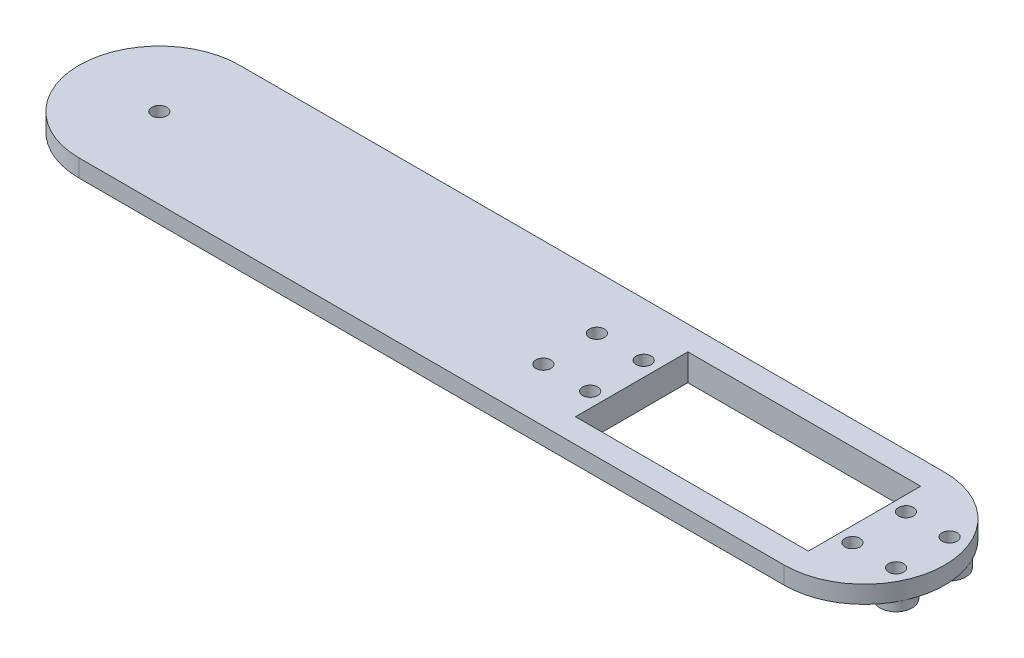
ISO-10303-21;
HEADER;
FILE_DESCRIPTION(('STEP AP214'),'2;1');
FILE_NAME('part.step','',(''),(''),'','','');
FILE_SCHEMA(('AUTOMOTIVE_DESIGN { 1 0 10303 214 1 1 1 1 }'));
ENDSEC;
DATA;
#1=APPLICATION_CONTEXT('core data for automotive mechanical design processes');
#2=APPLICATION_PROTOCOL_DEFINITION('international standard','automotive_design',2000,#1);
#3=PRODUCT_CONTEXT('',#1,'mechanical');
#4=PRODUCT('Part','Part','',(#3));
#5=PRODUCT_RELATED_PRODUCT_CATEGORY('part','',(#4));
#6=PRODUCT_DEFINITION_FORMATION('','',#4);
#7=PRODUCT_DEFINITION_CONTEXT('part definition',#1,'design');
#8=PRODUCT_DEFINITION('design','',#6,#7);
#9=PRODUCT_DEFINITION_SHAPE('','',#8);
#10=(LENGTH_UNIT() NAMED_UNIT(*) SI_UNIT(.MILLI.,.METRE.));
#11=(NAMED_UNIT(*) PLANE_ANGLE_UNIT() SI_UNIT($,.RADIAN.));
#12=(NAMED_UNIT(*) SI_UNIT($,.STERADIAN.) SOLID_ANGLE_UNIT());
#13=UNCERTAINTY_MEASURE_WITH_UNIT(LENGTH_MEASURE(1.E-05),#10,'distance_accuracy_value','');
#14=(GEOMETRIC_REPRESENTATION_CONTEXT(3) GLOBAL_UNCERTAINTY_ASSIGNED_CONTEXT((#13)) GLOBAL_UNIT_ASSIGNED_CONTEXT((#10,
#11,#12)) REPRESENTATION_CONTEXT('',''));
#15=CARTESIAN_POINT('',(0.,0.,0.));
#16=DIRECTION('',(0.,0.,1.));
#17=DIRECTION('',(1.,0.,0.));
#18=AXIS2_PLACEMENT_3D('',#15,#16,#17);
#19=CARTESIAN_POINT('',(131.75,1.73205080756887,0.));
#20=DIRECTION('',(0.,1.,0.));
#21=DIRECTION('',(0.,0.,1.));
#22=AXIS2_PLACEMENT_3D('',#19,#20,#21);
#23=CONICAL_SURFACE('',#22,15.,1.0471975511966);
#24=CARTESIAN_POINT('',(131.75,0.,0.));
#25=DIRECTION('',(0.,1.,0.));
#26=DIRECTION('',(0.,0.,1.));
#27=AXIS2_PLACEMENT_3D('',#24,#25,#26);
#28=CIRCLE('',#27,12.);
#29=CARTESIAN_POINT('',(141.077618933992,0.,7.54953806681159));
#30=VERTEX_POINT('',#29);
#31=CARTESIAN_POINT('',(131.75,0.,12.));
#32=VERTEX_POINT('',#31);
#33=EDGE_CURVE('E159',#30,#32,#28,.F.);
#34=ORIENTED_EDGE('',*,*,#33,.F.);
#35=CARTESIAN_POINT('',(141.077322224237,-0.000199999999996111,7.54935403868239));
#36=CARTESIAN_POINT('',(141.156557252533,0.0532118295520342,7.59849532245088));
#37=CARTESIAN_POINT('',(141.238157752973,0.106367857717863,7.64400414252747));
#38=CARTESIAN_POINT('',(141.405675913293,0.211924213773523,7.72739358204016));
#39=CARTESIAN_POINT('',(141.491595007884,0.264324282980244,7.76527164519906));
#40=CARTESIAN_POINT('',(141.755674700648,0.420294178495787,7.86707972239535));
#41=CARTESIAN_POINT('',(141.939658060023,0.522297255177833,7.91887223220731));
#42=CARTESIAN_POINT('',(142.318130790524,0.719604901713635,7.98681766693719));
#43=CARTESIAN_POINT('',(142.512644761588,0.814892474504301,8.00288309639194));
#44=CARTESIAN_POINT('',(142.905273479851,0.995738739577225,7.99627527436064));
#45=CARTESIAN_POINT('',(143.103381423363,1.08131396044428,7.97366892195532));
#46=CARTESIAN_POINT('',(143.479570242659,1.23346886037972,7.89137434460176));
#47=CARTESIAN_POINT('',(143.657943074556,1.30103767076017,7.83493708453998));
#48=CARTESIAN_POINT('',(143.917769278529,1.39282671410162,7.72464089293873));
#49=CARTESIAN_POINT('',(144.003120344002,1.42183829990772,7.68358149180939));
#50=CARTESIAN_POINT('',(144.170380115844,1.47642684541736,7.59304892589497));
#51=CARTESIAN_POINT('',(144.252289255344,1.50200423817333,7.54357682373972));
#52=CARTESIAN_POINT('',(144.473365142052,1.56780084372085,7.3949870309063));
#53=CARTESIAN_POINT('',(144.607925303175,1.60408236587907,7.28702479306733));
#54=CARTESIAN_POINT('',(144.857786247804,1.66365305840951,7.04791607168046));
#55=CARTESIAN_POINT('',(144.973101256229,1.68695185493206,6.91678686074885));
#56=CARTESIAN_POINT('',(145.17061181912,1.71824302781424,6.64792576225172));
#57=CARTESIAN_POINT('',(145.254843331859,1.72741466654152,6.51182432536296));
#58=CARTESIAN_POINT('',(145.400634043372,1.73395720153714,6.22773560641838));
#59=CARTESIAN_POINT('',(145.46219944674,1.7313313298441,6.0797515906164));
#60=CARTESIAN_POINT('',(145.558959984953,1.71470669394242,5.78235505494441));
#61=CARTESIAN_POINT('',(145.595078374449,1.70114927945453,5.63321644011278));
#62=CARTESIAN_POINT('',(145.64412187416,1.66364939914969,5.33247956634603));
#63=CARTESIAN_POINT('',(145.657047018265,1.63970694850689,5.18088131100513));
#64=CARTESIAN_POINT('',(145.660100556809,1.58165494976071,4.87679354111259));
#65=CARTESIAN_POINT('',(145.649840452357,1.54738060028454,4.72433217892592));
#66=CARTESIAN_POINT('',(145.606972106302,1.469768129052,4.42498204919217));
#67=CARTESIAN_POINT('',(145.574357809823,1.42642755381983,4.27809480283425));
#68=CARTESIAN_POINT('',(145.485912140682,1.32873844846912,3.98414475732927));
#69=CARTESIAN_POINT('',(145.428740320811,1.27386634548731,3.83766084394092));
#70=CARTESIAN_POINT('',(145.293933076532,1.15640642671068,3.55786580455135));
#71=CARTESIAN_POINT('',(145.216294424116,1.09381739463867,3.42455676104226));
#72=CARTESIAN_POINT('',(145.03531961341,0.9560317423036,3.16165162296549));
#73=CARTESIAN_POINT('',(144.930256154494,0.8802032181653,3.03357664651878));
#74=CARTESIAN_POINT('',(144.702831974037,0.722439146842617,2.79808492927113));
#75=CARTESIAN_POINT('',(144.580452359523,0.6404969760838,2.6906910590455));
#76=CARTESIAN_POINT('',(144.314666021577,0.467265574352683,2.49265184098017));
#77=CARTESIAN_POINT('',(144.170458773441,0.375709791660956,2.40330840728899));
#78=CARTESIAN_POINT('',(143.946044711935,0.236111891456239,2.28894315810378));
#79=CARTESIAN_POINT('',(143.869946077227,0.1892357821765,2.25411406625341));
#80=CARTESIAN_POINT('',(143.71544404268,0.0949069920211402,2.19103843568445));
#81=CARTESIAN_POINT('',(143.637041267394,0.0474544693952105,2.16279013139788));
#82=CARTESIAN_POINT('',(143.557677692172,-0.000200000000005171,2.13785729034971));
#83=B_SPLINE_CURVE_WITH_KNOTS('',3,(#35,#36,#37,#38,#39,#40,#41,#42,#43,#44,#45,#46,#47,#48,#49,
#50,#51,#52,#53,#54,#55,#56,#57,#58,#59,#60,#61,#62,#63,#64,#65,#66,#67,#68,#69,#70,#71,#72,#73,
#74,#75,#76,#77,#78,#79,#80,#81,#82),.UNSPECIFIED.,.F.,.F.,(4,2,2,2,2,2,2,2,2,2,2,2,2,2,2,2,2,2,
2,2,2,2,2,4),(0.,0.322173911690689,0.644455571713671,1.2910284071438,1.93918296091379,
2.58621739284116,3.17927178079541,3.47602612178944,3.7727430067872,4.29849498135218,
4.82385661224604,5.30238850109788,5.78078929964637,6.2407881517004,6.70078633162678,
7.1685494182307,7.636439253668,8.13398299914619,8.63160526375326,9.17590331670915,
9.72079987775982,10.2967240672052,10.584280375072,10.8717594450088),.UNSPECIFIED.);
#84=CARTESIAN_POINT('',(145.385890143295,1.73205080756883,6.25));
#85=VERTEX_POINT('',#84);
#86=EDGE_CURVE('E11',#30,#85,#83,.T.);
#87=ORIENTED_EDGE('',*,*,#86,.T.);
#88=CARTESIAN_POINT('',(131.75,1.73205080756887,0.));
#89=DIRECTION('',(0.,1.,0.));
#90=DIRECTION('',(0.,0.,1.));
#91=AXIS2_PLACEMENT_3D('',#88,#89,#90);
#92=CIRCLE('',#91,15.);
#93=CARTESIAN_POINT('',(131.75,1.73205080756887,15.));
#94=VERTEX_POINT('',#93);
#95=EDGE_CURVE('E173',#94,#85,#92,.T.);
#96=ORIENTED_EDGE('',*,*,#95,.F.);
#97=DIRECTION('',(0.,0.499999999999995,0.866025403784441));
#98=VECTOR('',#97,1.);
#99=CARTESIAN_POINT('',(131.75,0.,12.));
#100=LINE('',#99,#98);
#101=EDGE_CURVE('E183',#32,#94,#100,.T.);
#102=ORIENTED_EDGE('',*,*,#101,.F.);
#103=EDGE_LOOP('',(#34,#87,#96,#102));
#104=FACE_BOUND('',#103,.T.);
#105=ADVANCED_FACE('F43',(#104),#23,.T.);
#106=CARTESIAN_POINT('',(145.385890143295,1.73205080756883,-6.25));
#107=VERTEX_POINT('',#106);
#108=EDGE_CURVE('E153',#85,#107,#92,.T.);
#109=ORIENTED_EDGE('',*,*,#108,.F.);
#110=CARTESIAN_POINT('',(143.558010788115,0.,2.13796193318843));
#111=VERTEX_POINT('',#110);
#112=EDGE_CURVE('E48',#85,#111,#83,.T.);
#113=ORIENTED_EDGE('',*,*,#112,.T.);
#114=CARTESIAN_POINT('',(143.558010788115,0.,-2.13796193318843));
#115=VERTEX_POINT('',#114);
#116=EDGE_CURVE('E152',#115,#111,#28,.F.);
#117=ORIENTED_EDGE('',*,*,#116,.F.);
#118=CARTESIAN_POINT('',(141.077322224237,-0.000199999999996111,-7.54935403868239));
#119=CARTESIAN_POINT('',(141.156557252533,0.0532118295520342,-7.59849532245088));
#120=CARTESIAN_POINT('',(141.238157752973,0.106367857717863,-7.64400414252747));
#121=CARTESIAN_POINT('',(141.405675913293,0.211924213773523,-7.72739358204016));
#122=CARTESIAN_POINT('',(141.491595007884,0.264324282980244,-7.76527164519906));
#123=CARTESIAN_POINT('',(141.755674700648,0.420294178495787,-7.86707972239535));
#124=CARTESIAN_POINT('',(141.939658060023,0.522297255177833,-7.91887223220731));
#125=CARTESIAN_POINT('',(142.318130790524,0.719604901713635,-7.98681766693719));
#126=CARTESIAN_POINT('',(142.512644761588,0.814892474504301,-8.00288309639194));
#127=CARTESIAN_POINT('',(142.905273479851,0.995738739577225,-7.99627527436064));
#128=CARTESIAN_POINT('',(143.103381423363,1.08131396044428,-7.97366892195532));
#129=CARTESIAN_POINT('',(143.479570242659,1.23346886037972,-7.89137434460176));
#130=CARTESIAN_POINT('',(143.657943074556,1.30103767076017,-7.83493708453998));
#131=CARTESIAN_POINT('',(143.917769278529,1.39282671410162,-7.72464089293873));
#132=CARTESIAN_POINT('',(144.003120344002,1.42183829990772,-7.68358149180939));
#133=CARTESIAN_POINT('',(144.170380115844,1.47642684541736,-7.59304892589497));
#134=CARTESIAN_POINT('',(144.252289255344,1.50200423817333,-7.54357682373972));
#135=CARTESIAN_POINT('',(144.473365142052,1.56780084372085,-7.3949870309063));
#136=CARTESIAN_POINT('',(144.607925303175,1.60408236587907,-7.28702479306733));
#137=CARTESIAN_POINT('',(144.857786247804,1.66365305840951,-7.04791607168046));
#138=CARTESIAN_POINT('',(144.973101256229,1.68695185493206,-6.91678686074885));
#139=CARTESIAN_POINT('',(145.17061181912,1.71824302781424,-6.64792576225172));
#140=CARTESIAN_POINT('',(145.254843331859,1.72741466654152,-6.51182432536296));
#141=CARTESIAN_POINT('',(145.400634043372,1.73395720153714,-6.22773560641838));
#142=CARTESIAN_POINT('',(145.46219944674,1.7313313298441,-6.0797515906164));
#143=CARTESIAN_POINT('',(145.558959984953,1.71470669394242,-5.78235505494441));
#144=CARTESIAN_POINT('',(145.595078374449,1.70114927945453,-5.63321644011278));
#145=CARTESIAN_POINT('',(145.64412187416,1.66364939914969,-5.33247956634603));
#146=CARTESIAN_POINT('',(145.657047018265,1.63970694850689,-5.18088131100513));
#147=CARTESIAN_POINT('',(145.660100556809,1.58165494976071,-4.87679354111259));
#148=CARTESIAN_POINT('',(145.649840452357,1.54738060028454,-4.72433217892592));
#149=CARTESIAN_POINT('',(145.606972106302,1.469768129052,-4.42498204919217));
#150=CARTESIAN_POINT('',(145.574357809823,1.42642755381983,-4.27809480283425));
#151=CARTESIAN_POINT('',(145.485912140682,1.32873844846912,-3.98414475732927));
#152=CARTESIAN_POINT('',(145.428740320811,1.27386634548731,-3.83766084394092));
#153=CARTESIAN_POINT('',(145.293933076532,1.15640642671068,-3.55786580455135));
#154=CARTESIAN_POINT('',(145.216294424116,1.09381739463867,-3.42455676104226));
#155=CARTESIAN_POINT('',(145.03531961341,0.9560317423036,-3.16165162296549));
#156=CARTESIAN_POINT('',(144.930256154494,0.8802032181653,-3.03357664651878));
#157=CARTESIAN_POINT('',(144.702831974037,0.722439146842617,-2.79808492927113));
#158=CARTESIAN_POINT('',(144.580452359523,0.6404969760838,-2.6906910590455));
#159=CARTESIAN_POINT('',(144.314666021577,0.467265574352683,-2.49265184098017));
#160=CARTESIAN_POINT('',(144.170458773441,0.375709791660956,-2.40330840728899));
#161=CARTESIAN_POINT('',(143.946044711935,0.236111891456239,-2.28894315810378));
#162=CARTESIAN_POINT('',(143.869946077227,0.1892357821765,-2.25411406625341));
#163=CARTESIAN_POINT('',(143.71544404268,0.0949069920211402,-2.19103843568445));
#164=CARTESIAN_POINT('',(143.637041267394,0.0474544693952105,-2.16279013139788));
#165=CARTESIAN_POINT('',(143.557677692172,-0.000200000000005171,-2.13785729034971));
#166=B_SPLINE_CURVE_WITH_KNOTS('',3,(#118,#119,#120,#121,#122,#123,#124,#125,#126,#127,#128,
#129,#130,#131,#132,#133,#134,#135,#136,#137,#138,#139,#140,#141,#142,#143,#144,#145,#146,#147,
#148,#149,#150,#151,#152,#153,#154,#155,#156,#157,#158,#159,#160,#161,#162,#163,#164,#165),
.UNSPECIFIED.,.F.,.F.,(4,2,2,2,2,2,2,2,2,2,2,2,2,2,2,2,2,2,2,2,2,2,2,4),(0.,0.322173911690689,
0.644455571713671,1.2910284071438,1.93918296091379,2.58621739284116,3.17927178079541,
3.47602612178944,3.7727430067872,4.29849498135218,4.82385661224604,5.30238850109788,
5.78078929964637,6.2407881517004,6.70078633162678,7.1685494182307,7.636439253668,
8.13398299914619,8.63160526375326,9.17590331670915,9.72079987775982,10.2967240672052,
10.584280375072,10.8717594450088),.UNSPECIFIED.);
#167=EDGE_CURVE('E177',#107,#115,#166,.T.);
#168=ORIENTED_EDGE('',*,*,#167,.F.);
#169=EDGE_LOOP('',(#109,#113,#117,#168));
#170=FACE_BOUND('',#169,.T.);
#171=ADVANCED_FACE('F150',(#170),#23,.T.);
#172=CARTESIAN_POINT('',(141.077618933992,0.,-7.5495380668116));
#173=VERTEX_POINT('',#172);
#174=EDGE_CURVE('E155',#173,#107,#166,.T.);
#175=ORIENTED_EDGE('',*,*,#174,.F.);
#176=CARTESIAN_POINT('',(131.75,0.,-12.));
#177=VERTEX_POINT('',#176);
#178=EDGE_CURVE('E158',#177,#173,#28,.F.);
#179=ORIENTED_EDGE('',*,*,#178,.F.);
#180=DIRECTION('',(0.,-0.499999999999995,0.866025403784441));
#181=VECTOR('',#180,1.);
#182=CARTESIAN_POINT('',(131.75,1.73205080756887,-15.));
#183=LINE('',#182,#181);
#184=CARTESIAN_POINT('',(131.75,1.73205080756887,-15.));
#185=VERTEX_POINT('',#184);
#186=EDGE_CURVE('E186',#185,#177,#183,.T.);
#187=ORIENTED_EDGE('',*,*,#186,.F.);
#188=EDGE_CURVE('E172',#107,#185,#92,.T.);
#189=ORIENTED_EDGE('',*,*,#188,.F.);
#190=EDGE_LOOP('',(#175,#179,#187,#189));
#191=FACE_BOUND('',#190,.T.);
#192=ADVANCED_FACE('F251',(#191),#23,.T.);
#193=CARTESIAN_POINT('',(0.,5.,0.));
#194=DIRECTION('',(0.,1.,0.));
#195=DIRECTION('',(0.,0.,1.));
#196=AXIS2_PLACEMENT_3D('',#193,#194,#195);
#197=PLANE('',#196);
#198=CARTESIAN_POINT('',(142.658712114636,5.,5.));
#199=DIRECTION('',(0.,1.,0.));
#200=DIRECTION('',(0.,0.,1.));
#201=AXIS2_PLACEMENT_3D('',#198,#199,#200);
#202=CIRCLE('',#201,1.40000000000003);
#203=CARTESIAN_POINT('',(142.658712114636,5.,6.40000000000003));
#204=VERTEX_POINT('',#203);
#205=EDGE_CURVE('E145',#204,#204,#202,.T.);
#206=ORIENTED_EDGE('',*,*,#205,.F.);
#207=EDGE_LOOP('',(#206));
#208=FACE_BOUND('',#207,.T.);
#209=CARTESIAN_POINT('',(142.658712114636,5.,-5.));
#210=DIRECTION('',(0.,-1.,0.));
#211=DIRECTION('',(0.,0.,-1.));
#212=AXIS2_PLACEMENT_3D('',#209,#210,#211);
#213=CIRCLE('',#212,1.40000000000003);
#214=CARTESIAN_POINT('',(142.658712114636,5.,-6.40000000000003));
#215=VERTEX_POINT('',#214);
#216=EDGE_CURVE('E419',#215,#215,#213,.T.);
#217=ORIENTED_EDGE('',*,*,#216,.T.);
#218=EDGE_LOOP('',(#217));
#219=FACE_BOUND('',#218,.T.);
#220=CARTESIAN_POINT('',(76.7500000000001,5.,5.));
#221=DIRECTION('',(0.,-1.,0.));
#222=DIRECTION('',(0.,0.,-1.));
#223=AXIS2_PLACEMENT_3D('',#220,#221,#222);
#224=CIRCLE('',#223,1.4);
#225=CARTESIAN_POINT('',(76.7500000000001,5.,3.59999999999999));
#226=VERTEX_POINT('',#225);
#227=EDGE_CURVE('E181',#226,#226,#224,.T.);
#228=ORIENTED_EDGE('',*,*,#227,.T.);
#229=EDGE_LOOP('',(#228));
#230=FACE_BOUND('',#229,.T.);
#231=CARTESIAN_POINT('',(76.7500000000001,5.,-5.00000000000001));
#232=DIRECTION('',(0.,-1.,0.));
#233=DIRECTION('',(0.,0.,1.));
#234=AXIS2_PLACEMENT_3D('',#231,#232,#233);
#235=CIRCLE('',#234,1.4);
#236=CARTESIAN_POINT('',(76.7500000000001,5.,-3.6));
#237=VERTEX_POINT('',#236);
#238=EDGE_CURVE('E407',#237,#237,#235,.T.);
#239=ORIENTED_EDGE('',*,*,#238,.T.);
#240=EDGE_LOOP('',(#239));
#241=FACE_BOUND('',#240,.T.);
#242=CARTESIAN_POINT('',(134.5,5.,5.));
#243=DIRECTION('',(0.,1.,0.));
#244=DIRECTION('',(0.,0.,1.));
#245=AXIS2_PLACEMENT_3D('',#242,#243,#244);
#246=CIRCLE('',#245,1.40000000000003);
#247=CARTESIAN_POINT('',(134.5,5.,6.40000000000003));
#248=VERTEX_POINT('',#247);
#249=EDGE_CURVE('E394',#248,#248,#246,.T.);
#250=ORIENTED_EDGE('',*,*,#249,.F.);
#251=EDGE_LOOP('',(#250));
#252=FACE_BOUND('',#251,.T.);
#253=CARTESIAN_POINT('',(85.5000000000001,5.,-5.));
#254=DIRECTION('',(0.,1.,0.));
#255=DIRECTION('',(0.,0.,1.));
#256=AXIS2_PLACEMENT_3D('',#253,#254,#255);
#257=CIRCLE('',#256,1.4);
#258=CARTESIAN_POINT('',(85.5000000000001,5.,-3.6));
#259=VERTEX_POINT('',#258);
#260=EDGE_CURVE('E382',#259,#259,#257,.T.);
#261=ORIENTED_EDGE('',*,*,#260,.F.);
#262=EDGE_LOOP('',(#261));
#263=FACE_BOUND('',#262,.T.);
#264=DIRECTION('',(-1.,0.,0.));
#265=VECTOR('',#264,1.);
#266=CARTESIAN_POINT('',(88.2500000000001,5.,-10.5));
#267=LINE('',#266,#265);
#268=CARTESIAN_POINT('',(131.75,5.,-10.5));
#269=VERTEX_POINT('',#268);
#270=CARTESIAN_POINT('',(88.2500000000001,5.,-10.5));
#271=VERTEX_POINT('',#270);
#272=EDGE_CURVE('E376',#269,#271,#267,.T.);
#273=ORIENTED_EDGE('',*,*,#272,.F.);
#274=DIRECTION('',(0.,0.,-1.));
#275=VECTOR('',#274,1.);
#276=CARTESIAN_POINT('',(131.75,5.,10.5));
#277=LINE('',#276,#275);
#278=CARTESIAN_POINT('',(131.75,5.,10.5));
#279=VERTEX_POINT('',#278);
#280=EDGE_CURVE('E361',#279,#269,#277,.T.);
#281=ORIENTED_EDGE('',*,*,#280,.F.);
#282=DIRECTION('',(1.,0.,0.));
#283=VECTOR('',#282,1.);
#284=CARTESIAN_POINT('',(88.2500000000001,5.,10.5));
#285=LINE('',#284,#283);
#286=CARTESIAN_POINT('',(88.2500000000001,5.,10.5));
#287=VERTEX_POINT('',#286);
#288=EDGE_CURVE('E357',#287,#279,#285,.T.);
#289=ORIENTED_EDGE('',*,*,#288,.F.);
#290=DIRECTION('',(0.,0.,1.));
#291=VECTOR('',#290,1.);
#292=CARTESIAN_POINT('',(88.2500000000001,5.,10.5));
#293=LINE('',#292,#291);
#294=EDGE_CURVE('E373',#271,#287,#293,.T.);
#295=ORIENTED_EDGE('',*,*,#294,.F.);
#296=EDGE_LOOP('',(#273,#281,#289,#295));
#297=FACE_BOUND('',#296,.T.);
#298=CARTESIAN_POINT('',(131.75,5.,0.));
#299=DIRECTION('',(0.,1.,0.));
#300=DIRECTION('',(0.,0.,1.));
#301=AXIS2_PLACEMENT_3D('',#298,#299,#300);
#302=CIRCLE('',#301,15.);
#303=CARTESIAN_POINT('',(131.75,5.,15.));
#304=VERTEX_POINT('',#303);
#305=CARTESIAN_POINT('',(131.75,5.,-15.));
#306=VERTEX_POINT('',#305);
#307=EDGE_CURVE('E328',#304,#306,#302,.T.);
#308=ORIENTED_EDGE('',*,*,#307,.T.);
#309=DIRECTION('',(-1.,0.,0.));
#310=VECTOR('',#309,1.);
#311=CARTESIAN_POINT('',(0.,5.,-15.));
#312=LINE('',#311,#310);
#313=CARTESIAN_POINT('',(0.,5.,-15.));
#314=VERTEX_POINT('',#313);
#315=EDGE_CURVE('E324',#306,#314,#312,.T.);
#316=ORIENTED_EDGE('',*,*,#315,.T.);
#317=CARTESIAN_POINT('',(0.,5.,0.));
#318=DIRECTION('',(0.,1.,0.));
#319=DIRECTION('',(0.,0.,1.));
#320=AXIS2_PLACEMENT_3D('',#317,#318,#319);
#321=CIRCLE('',#320,15.);
#322=CARTESIAN_POINT('',(0.,5.,15.));
#323=VERTEX_POINT('',#322);
#324=EDGE_CURVE('E323',#314,#323,#321,.T.);
#325=ORIENTED_EDGE('',*,*,#324,.T.);
#326=DIRECTION('',(1.,0.,0.));
#327=VECTOR('',#326,1.);
#328=CARTESIAN_POINT('',(0.,5.,15.));
#329=LINE('',#328,#327);
#330=EDGE_CURVE('E343',#323,#304,#329,.T.);
#331=ORIENTED_EDGE('',*,*,#330,.T.);
#332=EDGE_LOOP('',(#308,#316,#325,#331));
#333=FACE_BOUND('',#332,.T.);
#334=CARTESIAN_POINT('',(0.,5.,0.));
#335=DIRECTION('',(0.,1.,0.));
#336=DIRECTION('',(0.,0.,1.));
#337=AXIS2_PLACEMENT_3D('',#334,#335,#336);
#338=CIRCLE('',#337,1.4);
#339=CARTESIAN_POINT('',(0.,5.,1.4));
#340=VERTEX_POINT('',#339);
#341=EDGE_CURVE('E371',#340,#340,#338,.T.);
#342=ORIENTED_EDGE('',*,*,#341,.F.);
#343=EDGE_LOOP('',(#342));
#344=FACE_BOUND('',#343,.T.);
#345=CARTESIAN_POINT('',(85.5000000000001,5.,5.));
#346=DIRECTION('',(0.,1.,0.));
#347=DIRECTION('',(0.,0.,-1.));
#348=AXIS2_PLACEMENT_3D('',#345,#346,#347);
#349=CIRCLE('',#348,1.4);
#350=CARTESIAN_POINT('',(85.5000000000001,5.,3.6));
#351=VERTEX_POINT('',#350);
#352=EDGE_CURVE('E388',#351,#351,#349,.T.);
#353=ORIENTED_EDGE('',*,*,#352,.F.);
#354=EDGE_LOOP('',(#353));
#355=FACE_BOUND('',#354,.T.);
#356=CARTESIAN_POINT('',(134.5,5.,-5.));
#357=DIRECTION('',(0.,1.,0.));
#358=DIRECTION('',(0.,0.,-1.));
#359=AXIS2_PLACEMENT_3D('',#356,#357,#358);
#360=CIRCLE('',#359,1.40000000000003);
#361=CARTESIAN_POINT('',(134.5,5.,-6.40000000000003));
#362=VERTEX_POINT('',#361);
#363=EDGE_CURVE('E400',#362,#362,#360,.T.);
#364=ORIENTED_EDGE('',*,*,#363,.F.);
#365=EDGE_LOOP('',(#364));
#366=FACE_BOUND('',#365,.T.);
#367=ADVANCED_FACE('F248',(#208,#219,#230,#241,#252,#263,#297,#333,#344,#355,#366),#197,.T.);
#368=CARTESIAN_POINT('',(0.,0.,0.));
#369=DIRECTION('',(0.,1.,0.));
#370=DIRECTION('',(0.,0.,1.));
#371=AXIS2_PLACEMENT_3D('',#368,#369,#370);
#372=PLANE('',#371);
#373=CARTESIAN_POINT('',(142.658712114636,0.,5.));
#374=DIRECTION('',(0.,1.,0.));
#375=DIRECTION('',(0.,0.,1.));
#376=AXIS2_PLACEMENT_3D('',#373,#374,#375);
#377=CIRCLE('',#376,1.40000000000003);
#378=CARTESIAN_POINT('',(142.658712114636,0.,6.40000000000003));
#379=VERTEX_POINT('',#378);
#380=EDGE_CURVE('E424',#379,#379,#377,.T.);
#381=ORIENTED_EDGE('',*,*,#380,.T.);
#382=EDGE_LOOP('',(#381));
#383=FACE_BOUND('',#382,.T.);
#384=ORIENTED_EDGE('',*,*,#116,.T.);
#385=CARTESIAN_POINT('',(142.658712114636,0.,5.));
#386=DIRECTION('',(0.,1.,0.));
#387=DIRECTION('',(0.,0.,1.));
#388=AXIS2_PLACEMENT_3D('',#385,#386,#387);
#389=CIRCLE('',#388,2.99999999999999);
#390=EDGE_CURVE('E64',#30,#111,#389,.T.);
#391=ORIENTED_EDGE('',*,*,#390,.F.);
#392=ORIENTED_EDGE('',*,*,#33,.T.);
#393=DIRECTION('',(-1.,0.,0.));
#394=VECTOR('',#393,1.);
#395=CARTESIAN_POINT('',(0.,0.,12.));
#396=LINE('',#395,#394);
#397=CARTESIAN_POINT('',(0.,0.,12.));
#398=VERTEX_POINT('',#397);
#399=EDGE_CURVE('E162',#32,#398,#396,.T.);
#400=ORIENTED_EDGE('',*,*,#399,.T.);
#401=CARTESIAN_POINT('',(0.,0.,0.));
#402=DIRECTION('',(0.,1.,0.));
#403=DIRECTION('',(0.,0.,1.));
#404=AXIS2_PLACEMENT_3D('',#401,#402,#403);
#405=CIRCLE('',#404,12.);
#406=CARTESIAN_POINT('',(0.,0.,-12.));
#407=VERTEX_POINT('',#406);
#408=EDGE_CURVE('E167',#398,#407,#405,.F.);
#409=ORIENTED_EDGE('',*,*,#408,.T.);
#410=DIRECTION('',(1.,0.,0.));
#411=VECTOR('',#410,1.);
#412=CARTESIAN_POINT('',(0.,0.,-12.));
#413=LINE('',#412,#411);
#414=EDGE_CURVE('E161',#407,#177,#413,.T.);
#415=ORIENTED_EDGE('',*,*,#414,.T.);
#416=ORIENTED_EDGE('',*,*,#178,.T.);
#417=CARTESIAN_POINT('',(142.658712114636,0.,-5.));
#418=DIRECTION('',(0.,-1.,0.));
#419=DIRECTION('',(0.,0.,-1.));
#420=AXIS2_PLACEMENT_3D('',#417,#418,#419);
#421=CIRCLE('',#420,2.99999999999999);
#422=EDGE_CURVE('E70',#173,#115,#421,.T.);
#423=ORIENTED_EDGE('',*,*,#422,.T.);
#424=EDGE_LOOP('',(#384,#391,#392,#400,#409,#415,#416,#423));
#425=FACE_BOUND('',#424,.T.);
#426=CARTESIAN_POINT('',(142.658712114636,0.,-5.));
#427=DIRECTION('',(0.,-1.,0.));
#428=DIRECTION('',(0.,0.,-1.));
#429=AXIS2_PLACEMENT_3D('',#426,#427,#428);
#430=CIRCLE('',#429,1.40000000000003);
#431=CARTESIAN_POINT('',(142.658712114636,0.,-6.40000000000003));
#432=VERTEX_POINT('',#431);
#433=EDGE_CURVE('E144',#432,#432,#430,.T.);
#434=ORIENTED_EDGE('',*,*,#433,.F.);
#435=EDGE_LOOP('',(#434));
#436=FACE_BOUND('',#435,.T.);
#437=CARTESIAN_POINT('',(76.7500000000001,0.,5.));
#438=DIRECTION('',(0.,-1.,0.));
#439=DIRECTION('',(0.,0.,-1.));
#440=AXIS2_PLACEMENT_3D('',#437,#438,#439);
#441=CIRCLE('',#440,1.4);
#442=CARTESIAN_POINT('',(76.7500000000001,0.,3.59999999999999));
#443=VERTEX_POINT('',#442);
#444=EDGE_CURVE('E413',#443,#443,#441,.T.);
#445=ORIENTED_EDGE('',*,*,#444,.F.);
#446=EDGE_LOOP('',(#445));
#447=FACE_BOUND('',#446,.T.);
#448=CARTESIAN_POINT('',(76.7500000000001,0.,-5.00000000000001));
#449=DIRECTION('',(0.,-1.,0.));
#450=DIRECTION('',(0.,0.,1.));
#451=AXIS2_PLACEMENT_3D('',#448,#449,#450);
#452=CIRCLE('',#451,1.4);
#453=CARTESIAN_POINT('',(76.7500000000001,0.,-3.6));
#454=VERTEX_POINT('',#453);
#455=EDGE_CURVE('E410',#454,#454,#452,.T.);
#456=ORIENTED_EDGE('',*,*,#455,.F.);
#457=EDGE_LOOP('',(#456));
#458=FACE_BOUND('',#457,.T.);
#459=DIRECTION('',(0.,0.,-1.));
#460=VECTOR('',#459,1.);
#461=CARTESIAN_POINT('',(131.75,0.,10.5));
#462=LINE('',#461,#460);
#463=CARTESIAN_POINT('',(131.75,0.,10.5));
#464=VERTEX_POINT('',#463);
#465=CARTESIAN_POINT('',(131.75,0.,-10.5));
#466=VERTEX_POINT('',#465);
#467=EDGE_CURVE('E368',#464,#466,#462,.T.);
#468=ORIENTED_EDGE('',*,*,#467,.T.);
#469=DIRECTION('',(-1.,0.,0.));
#470=VECTOR('',#469,1.);
#471=CARTESIAN_POINT('',(88.2500000000001,0.,-10.5));
#472=LINE('',#471,#470);
#473=CARTESIAN_POINT('',(88.2500000000001,0.,-10.5));
#474=VERTEX_POINT('',#473);
#475=EDGE_CURVE('E365',#466,#474,#472,.T.);
#476=ORIENTED_EDGE('',*,*,#475,.T.);
#477=DIRECTION('',(0.,0.,1.));
#478=VECTOR('',#477,1.);
#479=CARTESIAN_POINT('',(88.2500000000001,0.,10.5));
#480=LINE('',#479,#478);
#481=CARTESIAN_POINT('',(88.2500000000001,0.,10.5));
#482=VERTEX_POINT('',#481);
#483=EDGE_CURVE('E362',#474,#482,#480,.T.);
#484=ORIENTED_EDGE('',*,*,#483,.T.);
#485=DIRECTION('',(1.,0.,0.));
#486=VECTOR('',#485,1.);
#487=CARTESIAN_POINT('',(88.2500000000001,0.,10.5));
#488=LINE('',#487,#486);
#489=EDGE_CURVE('E358',#482,#464,#488,.T.);
#490=ORIENTED_EDGE('',*,*,#489,.T.);
#491=EDGE_LOOP('',(#468,#476,#484,#490));
#492=FACE_BOUND('',#491,.T.);
#493=CARTESIAN_POINT('',(0.,0.,0.));
#494=DIRECTION('',(0.,1.,0.));
#495=DIRECTION('',(0.,0.,1.));
#496=AXIS2_PLACEMENT_3D('',#493,#494,#495);
#497=CIRCLE('',#496,1.4);
#498=CARTESIAN_POINT('',(0.,0.,1.4));
#499=VERTEX_POINT('',#498);
#500=EDGE_CURVE('E379',#499,#499,#497,.T.);
#501=ORIENTED_EDGE('',*,*,#500,.T.);
#502=EDGE_LOOP('',(#501));
#503=FACE_BOUND('',#502,.T.);
#504=CARTESIAN_POINT('',(85.5000000000001,0.,-5.));
#505=DIRECTION('',(0.,1.,0.));
#506=DIRECTION('',(0.,0.,1.));
#507=AXIS2_PLACEMENT_3D('',#504,#505,#506);
#508=CIRCLE('',#507,1.4);
#509=CARTESIAN_POINT('',(85.5000000000001,0.,-3.6));
#510=VERTEX_POINT('',#509);
#511=EDGE_CURVE('E385',#510,#510,#508,.T.);
#512=ORIENTED_EDGE('',*,*,#511,.T.);
#513=EDGE_LOOP('',(#512));
#514=FACE_BOUND('',#513,.T.);
#515=CARTESIAN_POINT('',(85.5000000000001,0.,5.));
#516=DIRECTION('',(0.,1.,0.));
#517=DIRECTION('',(0.,0.,-1.));
#518=AXIS2_PLACEMENT_3D('',#515,#516,#517);
#519=CIRCLE('',#518,1.4);
#520=CARTESIAN_POINT('',(85.5000000000001,0.,3.6));
#521=VERTEX_POINT('',#520);
#522=EDGE_CURVE('E391',#521,#521,#519,.T.);
#523=ORIENTED_EDGE('',*,*,#522,.T.);
#524=EDGE_LOOP('',(#523));
#525=FACE_BOUND('',#524,.T.);
#526=CARTESIAN_POINT('',(134.5,0.,5.));
#527=DIRECTION('',(0.,1.,0.));
#528=DIRECTION('',(0.,0.,1.));
#529=AXIS2_PLACEMENT_3D('',#526,#527,#528);
#530=CIRCLE('',#529,1.40000000000003);
#531=CARTESIAN_POINT('',(134.5,0.,6.40000000000003));
#532=VERTEX_POINT('',#531);
#533=EDGE_CURVE('E397',#532,#532,#530,.T.);
#534=ORIENTED_EDGE('',*,*,#533,.T.);
#535=EDGE_LOOP('',(#534));
#536=FACE_BOUND('',#535,.T.);
#537=CARTESIAN_POINT('',(134.5,0.,-5.));
#538=DIRECTION('',(0.,1.,0.));
#539=DIRECTION('',(0.,0.,-1.));
#540=AXIS2_PLACEMENT_3D('',#537,#538,#539);
#541=CIRCLE('',#540,1.40000000000003);
#542=CARTESIAN_POINT('',(134.5,0.,-6.40000000000003));
#543=VERTEX_POINT('',#542);
#544=EDGE_CURVE('E188',#543,#543,#541,.T.);
#545=ORIENTED_EDGE('',*,*,#544,.T.);
#546=EDGE_LOOP('',(#545));
#547=FACE_BOUND('',#546,.T.);
#548=ADVANCED_FACE('F156',(#383,#425,#436,#447,#458,#492,#503,#514,#525,#536,#547),#372,.F.);
#549=CARTESIAN_POINT('',(0.,5.,0.));
#550=DIRECTION('',(0.,-1.,0.));
#551=DIRECTION('',(0.,0.,-1.));
#552=AXIS2_PLACEMENT_3D('',#549,#550,#551);
#553=CYLINDRICAL_SURFACE('',#552,15.);
#554=DIRECTION('',(0.,-1.,0.));
#555=VECTOR('',#554,1.);
#556=CARTESIAN_POINT('',(0.,5.,-15.));
#557=LINE('',#556,#555);
#558=CARTESIAN_POINT('',(0.,1.73205080756887,-15.));
#559=VERTEX_POINT('',#558);
#560=EDGE_CURVE('E314',#314,#559,#557,.T.);
#561=ORIENTED_EDGE('',*,*,#560,.T.);
#562=CARTESIAN_POINT('',(0.,1.73205080756887,0.));
#563=DIRECTION('',(0.,1.,0.));
#564=DIRECTION('',(0.,0.,1.));
#565=AXIS2_PLACEMENT_3D('',#562,#563,#564);
#566=CIRCLE('',#565,15.);
#567=CARTESIAN_POINT('',(0.,1.73205080756887,15.));
#568=VERTEX_POINT('',#567);
#569=EDGE_CURVE('E320',#559,#568,#566,.T.);
#570=ORIENTED_EDGE('',*,*,#569,.T.);
#571=DIRECTION('',(0.,-1.,0.));
#572=VECTOR('',#571,1.);
#573=CARTESIAN_POINT('',(0.,5.,15.));
#574=LINE('',#573,#572);
#575=EDGE_CURVE('E334',#323,#568,#574,.T.);
#576=ORIENTED_EDGE('',*,*,#575,.F.);
#577=ORIENTED_EDGE('',*,*,#324,.F.);
#578=EDGE_LOOP('',(#561,#570,#576,#577));
#579=FACE_BOUND('',#578,.T.);
#580=ADVANCED_FACE('F255',(#579),#553,.T.);
#581=CARTESIAN_POINT('',(0.,5.,15.));
#582=DIRECTION('',(0.,0.,-1.));
#583=DIRECTION('',(-1.,0.,0.));
#584=AXIS2_PLACEMENT_3D('',#581,#582,#583);
#585=PLANE('',#584);
#586=ORIENTED_EDGE('',*,*,#575,.T.);
#587=DIRECTION('',(1.,0.,0.));
#588=VECTOR('',#587,1.);
#589=CARTESIAN_POINT('',(0.,1.73205080756887,15.));
#590=LINE('',#589,#588);
#591=EDGE_CURVE('E175',#568,#94,#590,.T.);
#592=ORIENTED_EDGE('',*,*,#591,.T.);
#593=DIRECTION('',(0.,-1.,0.));
#594=VECTOR('',#593,1.);
#595=CARTESIAN_POINT('',(131.75,5.,15.));
#596=LINE('',#595,#594);
#597=EDGE_CURVE('E326',#304,#94,#596,.T.);
#598=ORIENTED_EDGE('',*,*,#597,.F.);
#599=ORIENTED_EDGE('',*,*,#330,.F.);
#600=EDGE_LOOP('',(#586,#592,#598,#599));
#601=FACE_BOUND('',#600,.T.);
#602=ADVANCED_FACE('F263',(#601),#585,.F.);
#603=CARTESIAN_POINT('',(131.75,5.,0.));
#604=DIRECTION('',(0.,-1.,0.));
#605=DIRECTION('',(0.,0.,-1.));
#606=AXIS2_PLACEMENT_3D('',#603,#604,#605);
#607=CYLINDRICAL_SURFACE('',#606,15.);
#608=DIRECTION('',(0.,-1.,0.));
#609=VECTOR('',#608,1.);
#610=CARTESIAN_POINT('',(131.75,5.,-15.));
#611=LINE('',#610,#609);
#612=EDGE_CURVE('E317',#306,#185,#611,.T.);
#613=ORIENTED_EDGE('',*,*,#612,.F.);
#614=ORIENTED_EDGE('',*,*,#307,.F.);
#615=ORIENTED_EDGE('',*,*,#597,.T.);
#616=ORIENTED_EDGE('',*,*,#95,.T.);
#617=ORIENTED_EDGE('',*,*,#108,.T.);
#618=ORIENTED_EDGE('',*,*,#188,.T.);
#619=EDGE_LOOP('',(#613,#614,#615,#616,#617,#618));
#620=FACE_BOUND('',#619,.T.);
#621=ADVANCED_FACE('F259',(#620),#607,.T.);
#622=CARTESIAN_POINT('',(0.,5.,-15.));
#623=DIRECTION('',(0.,0.,1.));
#624=DIRECTION('',(1.,0.,0.));
#625=AXIS2_PLACEMENT_3D('',#622,#623,#624);
#626=PLANE('',#625);
#627=ORIENTED_EDGE('',*,*,#612,.T.);
#628=DIRECTION('',(-1.,0.,0.));
#629=VECTOR('',#628,1.);
#630=CARTESIAN_POINT('',(0.,1.73205080756887,-15.));
#631=LINE('',#630,#629);
#632=EDGE_CURVE('E170',#185,#559,#631,.T.);
#633=ORIENTED_EDGE('',*,*,#632,.T.);
#634=ORIENTED_EDGE('',*,*,#560,.F.);
#635=ORIENTED_EDGE('',*,*,#315,.F.);
#636=EDGE_LOOP('',(#627,#633,#634,#635));
#637=FACE_BOUND('',#636,.T.);
#638=ADVANCED_FACE('F246',(#637),#626,.F.);
#639=CARTESIAN_POINT('',(131.75,5.,10.5));
#640=DIRECTION('',(-1.,0.,0.));
#641=DIRECTION('',(0.,0.,1.));
#642=AXIS2_PLACEMENT_3D('',#639,#640,#641);
#643=PLANE('',#642);
#644=ORIENTED_EDGE('',*,*,#467,.F.);
#645=DIRECTION('',(0.,-1.,0.));
#646=VECTOR('',#645,1.);
#647=CARTESIAN_POINT('',(131.75,5.,10.5));
#648=LINE('',#647,#646);
#649=EDGE_CURVE('E354',#279,#464,#648,.T.);
#650=ORIENTED_EDGE('',*,*,#649,.F.);
#651=ORIENTED_EDGE('',*,*,#280,.T.);
#652=DIRECTION('',(0.,-1.,0.));
#653=VECTOR('',#652,1.);
#654=CARTESIAN_POINT('',(131.75,5.,-10.5));
#655=LINE('',#654,#653);
#656=EDGE_CURVE('E347',#269,#466,#655,.T.);
#657=ORIENTED_EDGE('',*,*,#656,.T.);
#658=EDGE_LOOP('',(#644,#650,#651,#657));
#659=FACE_BOUND('',#658,.T.);
#660=ADVANCED_FACE('F242',(#659),#643,.T.);
#661=CARTESIAN_POINT('',(88.2500000000001,5.,-10.5));
#662=DIRECTION('',(0.,0.,1.));
#663=DIRECTION('',(1.,0.,0.));
#664=AXIS2_PLACEMENT_3D('',#661,#662,#663);
#665=PLANE('',#664);
#666=ORIENTED_EDGE('',*,*,#475,.F.);
#667=ORIENTED_EDGE('',*,*,#656,.F.);
#668=ORIENTED_EDGE('',*,*,#272,.T.);
#669=DIRECTION('',(0.,-1.,0.));
#670=VECTOR('',#669,1.);
#671=CARTESIAN_POINT('',(88.2500000000001,5.,-10.5));
#672=LINE('',#671,#670);
#673=EDGE_CURVE('E350',#271,#474,#672,.T.);
#674=ORIENTED_EDGE('',*,*,#673,.T.);
#675=EDGE_LOOP('',(#666,#667,#668,#674));
#676=FACE_BOUND('',#675,.T.);
#677=ADVANCED_FACE('F238',(#676),#665,.T.);
#678=CARTESIAN_POINT('',(88.2500000000001,5.,10.5));
#679=DIRECTION('',(1.,0.,0.));
#680=DIRECTION('',(0.,0.,-1.));
#681=AXIS2_PLACEMENT_3D('',#678,#679,#680);
#682=PLANE('',#681);
#683=ORIENTED_EDGE('',*,*,#483,.F.);
#684=ORIENTED_EDGE('',*,*,#673,.F.);
#685=ORIENTED_EDGE('',*,*,#294,.T.);
#686=DIRECTION('',(0.,-1.,0.));
#687=VECTOR('',#686,1.);
#688=CARTESIAN_POINT('',(88.2500000000001,5.,10.5));
#689=LINE('',#688,#687);
#690=EDGE_CURVE('E352',#287,#482,#689,.T.);
#691=ORIENTED_EDGE('',*,*,#690,.T.);
#692=EDGE_LOOP('',(#683,#684,#685,#691));
#693=FACE_BOUND('',#692,.T.);
#694=ADVANCED_FACE('F234',(#693),#682,.T.);
#695=CARTESIAN_POINT('',(88.2500000000001,5.,10.5));
#696=DIRECTION('',(0.,0.,-1.));
#697=DIRECTION('',(-1.,0.,0.));
#698=AXIS2_PLACEMENT_3D('',#695,#696,#697);
#699=PLANE('',#698);
#700=ORIENTED_EDGE('',*,*,#489,.F.);
#701=ORIENTED_EDGE('',*,*,#690,.F.);
#702=ORIENTED_EDGE('',*,*,#288,.T.);
#703=ORIENTED_EDGE('',*,*,#649,.T.);
#704=EDGE_LOOP('',(#700,#701,#702,#703));
#705=FACE_BOUND('',#704,.T.);
#706=ADVANCED_FACE('F230',(#705),#699,.T.);
#707=CARTESIAN_POINT('',(0.,5.,0.));
#708=DIRECTION('',(0.,-1.,0.));
#709=DIRECTION('',(0.,0.,-1.));
#710=AXIS2_PLACEMENT_3D('',#707,#708,#709);
#711=CYLINDRICAL_SURFACE('',#710,1.4);
#712=ORIENTED_EDGE('',*,*,#341,.T.);
#713=EDGE_LOOP('',(#712));
#714=FACE_BOUND('',#713,.T.);
#715=ORIENTED_EDGE('',*,*,#500,.F.);
#716=EDGE_LOOP('',(#715));
#717=FACE_BOUND('',#716,.T.);
#718=ADVANCED_FACE('F226',(#714,#717),#711,.F.);
#719=CARTESIAN_POINT('',(85.5000000000001,5.,-5.));
#720=DIRECTION('',(0.,-1.,0.));
#721=DIRECTION('',(0.,0.,-1.));
#722=AXIS2_PLACEMENT_3D('',#719,#720,#721);
#723=CYLINDRICAL_SURFACE('',#722,1.4);
#724=ORIENTED_EDGE('',*,*,#260,.T.);
#725=EDGE_LOOP('',(#724));
#726=FACE_BOUND('',#725,.T.);
#727=ORIENTED_EDGE('',*,*,#511,.F.);
#728=EDGE_LOOP('',(#727));
#729=FACE_BOUND('',#728,.T.);
#730=ADVANCED_FACE('F222',(#726,#729),#723,.F.);
#731=CARTESIAN_POINT('',(85.5000000000001,5.,5.));
#732=DIRECTION('',(0.,-1.,0.));
#733=DIRECTION('',(0.,0.,-1.));
#734=AXIS2_PLACEMENT_3D('',#731,#732,#733);
#735=CYLINDRICAL_SURFACE('',#734,1.4);
#736=ORIENTED_EDGE('',*,*,#352,.T.);
#737=EDGE_LOOP('',(#736));
#738=FACE_BOUND('',#737,.T.);
#739=ORIENTED_EDGE('',*,*,#522,.F.);
#740=EDGE_LOOP('',(#739));
#741=FACE_BOUND('',#740,.T.);
#742=ADVANCED_FACE('F218',(#738,#741),#735,.F.);
#743=CARTESIAN_POINT('',(134.5,5.,5.));
#744=DIRECTION('',(0.,-1.,0.));
#745=DIRECTION('',(0.,0.,-1.));
#746=AXIS2_PLACEMENT_3D('',#743,#744,#745);
#747=CYLINDRICAL_SURFACE('',#746,1.40000000000003);
#748=ORIENTED_EDGE('',*,*,#249,.T.);
#749=EDGE_LOOP('',(#748));
#750=FACE_BOUND('',#749,.T.);
#751=ORIENTED_EDGE('',*,*,#533,.F.);
#752=EDGE_LOOP('',(#751));
#753=FACE_BOUND('',#752,.T.);
#754=ADVANCED_FACE('F214',(#750,#753),#747,.F.);
#755=CARTESIAN_POINT('',(134.5,5.,-5.));
#756=DIRECTION('',(0.,-1.,0.));
#757=DIRECTION('',(0.,0.,-1.));
#758=AXIS2_PLACEMENT_3D('',#755,#756,#757);
#759=CYLINDRICAL_SURFACE('',#758,1.40000000000003);
#760=ORIENTED_EDGE('',*,*,#363,.T.);
#761=EDGE_LOOP('',(#760));
#762=FACE_BOUND('',#761,.T.);
#763=ORIENTED_EDGE('',*,*,#544,.F.);
#764=EDGE_LOOP('',(#763));
#765=FACE_BOUND('',#764,.T.);
#766=ADVANCED_FACE('F210',(#762,#765),#759,.F.);
#767=CARTESIAN_POINT('',(0.,1.73205080756887,-15.));
#768=DIRECTION('',(0.,0.866025403784441,0.499999999999995));
#769=DIRECTION('',(-1.,0.,0.));
#770=AXIS2_PLACEMENT_3D('',#767,#768,#769);
#771=PLANE('',#770);
#772=ORIENTED_EDGE('',*,*,#186,.T.);
#773=ORIENTED_EDGE('',*,*,#414,.F.);
#774=DIRECTION('',(0.,-0.499999999999995,0.866025403784441));
#775=VECTOR('',#774,1.);
#776=CARTESIAN_POINT('',(0.,1.73205080756887,-15.));
#777=LINE('',#776,#775);
#778=EDGE_CURVE('E180',#559,#407,#777,.T.);
#779=ORIENTED_EDGE('',*,*,#778,.F.);
#780=ORIENTED_EDGE('',*,*,#632,.F.);
#781=EDGE_LOOP('',(#772,#773,#779,#780));
#782=FACE_BOUND('',#781,.T.);
#783=ADVANCED_FACE('F213',(#782),#771,.F.);
#784=CARTESIAN_POINT('',(0.,1.73205080756887,15.));
#785=DIRECTION('',(0.,0.866025403784441,-0.499999999999995));
#786=DIRECTION('',(1.,0.,0.));
#787=AXIS2_PLACEMENT_3D('',#784,#785,#786);
#788=PLANE('',#787);
#789=ORIENTED_EDGE('',*,*,#101,.T.);
#790=ORIENTED_EDGE('',*,*,#591,.F.);
#791=DIRECTION('',(0.,0.499999999999995,0.866025403784441));
#792=VECTOR('',#791,1.);
#793=CARTESIAN_POINT('',(0.,0.,12.));
#794=LINE('',#793,#792);
#795=EDGE_CURVE('E178',#398,#568,#794,.T.);
#796=ORIENTED_EDGE('',*,*,#795,.F.);
#797=ORIENTED_EDGE('',*,*,#399,.F.);
#798=EDGE_LOOP('',(#789,#790,#796,#797));
#799=FACE_BOUND('',#798,.T.);
#800=ADVANCED_FACE('F277',(#799),#788,.F.);
#801=CARTESIAN_POINT('',(0.,1.73205080756887,0.));
#802=DIRECTION('',(0.,1.,0.));
#803=DIRECTION('',(0.,0.,1.));
#804=AXIS2_PLACEMENT_3D('',#801,#802,#803);
#805=CONICAL_SURFACE('',#804,15.,1.0471975511966);
#806=ORIENTED_EDGE('',*,*,#778,.T.);
#807=ORIENTED_EDGE('',*,*,#408,.F.);
#808=ORIENTED_EDGE('',*,*,#795,.T.);
#809=ORIENTED_EDGE('',*,*,#569,.F.);
#810=EDGE_LOOP('',(#806,#807,#808,#809));
#811=FACE_BOUND('',#810,.T.);
#812=ADVANCED_FACE('F208',(#811),#805,.T.);
#813=CARTESIAN_POINT('',(76.7500000000001,5.,-5.00000000000001));
#814=DIRECTION('',(0.,-1.,0.));
#815=DIRECTION('',(0.,0.,-1.));
#816=AXIS2_PLACEMENT_3D('',#813,#814,#815);
#817=CYLINDRICAL_SURFACE('',#816,1.4);
#818=ORIENTED_EDGE('',*,*,#238,.F.);
#819=EDGE_LOOP('',(#818));
#820=FACE_BOUND('',#819,.T.);
#821=ORIENTED_EDGE('',*,*,#455,.T.);
#822=EDGE_LOOP('',(#821));
#823=FACE_BOUND('',#822,.T.);
#824=ADVANCED_FACE('F204',(#820,#823),#817,.F.);
#825=CARTESIAN_POINT('',(76.7500000000001,5.,5.));
#826=DIRECTION('',(0.,-1.,0.));
#827=DIRECTION('',(0.,0.,-1.));
#828=AXIS2_PLACEMENT_3D('',#825,#826,#827);
#829=CYLINDRICAL_SURFACE('',#828,1.4);
#830=ORIENTED_EDGE('',*,*,#227,.F.);
#831=EDGE_LOOP('',(#830));
#832=FACE_BOUND('',#831,.T.);
#833=ORIENTED_EDGE('',*,*,#444,.T.);
#834=EDGE_LOOP('',(#833));
#835=FACE_BOUND('',#834,.T.);
#836=ADVANCED_FACE('F200',(#832,#835),#829,.F.);
#837=CARTESIAN_POINT('',(142.658712114636,5.,-5.));
#838=DIRECTION('',(0.,-1.,0.));
#839=DIRECTION('',(0.,0.,-1.));
#840=AXIS2_PLACEMENT_3D('',#837,#838,#839);
#841=CYLINDRICAL_SURFACE('',#840,2.99999999999999);
#842=ORIENTED_EDGE('',*,*,#422,.F.);
#843=ORIENTED_EDGE('',*,*,#174,.T.);
#844=ORIENTED_EDGE('',*,*,#167,.T.);
#845=EDGE_LOOP('',(#842,#843,#844));
#846=FACE_BOUND('',#845,.T.);
#847=ADVANCED_FACE('F194',(#846),#841,.T.);
#848=CARTESIAN_POINT('',(142.658712114636,5.,-5.));
#849=DIRECTION('',(0.,-1.,0.));
#850=DIRECTION('',(0.,0.,-1.));
#851=AXIS2_PLACEMENT_3D('',#848,#849,#850);
#852=CYLINDRICAL_SURFACE('',#851,1.40000000000003);
#853=ORIENTED_EDGE('',*,*,#216,.F.);
#854=EDGE_LOOP('',(#853));
#855=FACE_BOUND('',#854,.T.);
#856=ORIENTED_EDGE('',*,*,#433,.T.);
#857=EDGE_LOOP('',(#856));
#858=FACE_BOUND('',#857,.T.);
#859=ADVANCED_FACE('F199',(#855,#858),#852,.F.);
#860=CARTESIAN_POINT('',(142.658712114636,5.,5.));
#861=DIRECTION('',(0.,-1.,0.));
#862=DIRECTION('',(0.,0.,-1.));
#863=AXIS2_PLACEMENT_3D('',#860,#861,#862);
#864=CYLINDRICAL_SURFACE('',#863,2.99999999999999);
#865=ORIENTED_EDGE('',*,*,#86,.F.);
#866=ORIENTED_EDGE('',*,*,#390,.T.);
#867=ORIENTED_EDGE('',*,*,#112,.F.);
#868=EDGE_LOOP('',(#865,#866,#867));
#869=FACE_BOUND('',#868,.T.);
#870=ADVANCED_FACE('F142',(#869),#864,.T.);
#871=CARTESIAN_POINT('',(142.658712114636,5.,5.));
#872=DIRECTION('',(0.,-1.,0.));
#873=DIRECTION('',(0.,0.,-1.));
#874=AXIS2_PLACEMENT_3D('',#871,#872,#873);
#875=CYLINDRICAL_SURFACE('',#874,1.40000000000003);
#876=ORIENTED_EDGE('',*,*,#205,.T.);
#877=EDGE_LOOP('',(#876));
#878=FACE_BOUND('',#877,.T.);
#879=ORIENTED_EDGE('',*,*,#380,.F.);
#880=EDGE_LOOP('',(#879));
#881=FACE_BOUND('',#880,.T.);
#882=ADVANCED_FACE('F430',(#878,#881),#875,.F.);
#883=CLOSED_SHELL('',(#105,#171,#192,#367,#548,#580,#602,#621,#638,#660,#677,#694,#706,#718,
#730,#742,#754,#766,#783,#800,#812,#824,#836,#847,#859,#870,#882));
#884=MANIFOLD_SOLID_BREP('B2',#883);
#885=ADVANCED_BREP_SHAPE_REPRESENTATION('',(#18,#884),#14);
#886=SHAPE_DEFINITION_REPRESENTATION(#9,#885);
ENDSEC;
END-ISO-10303-21;
